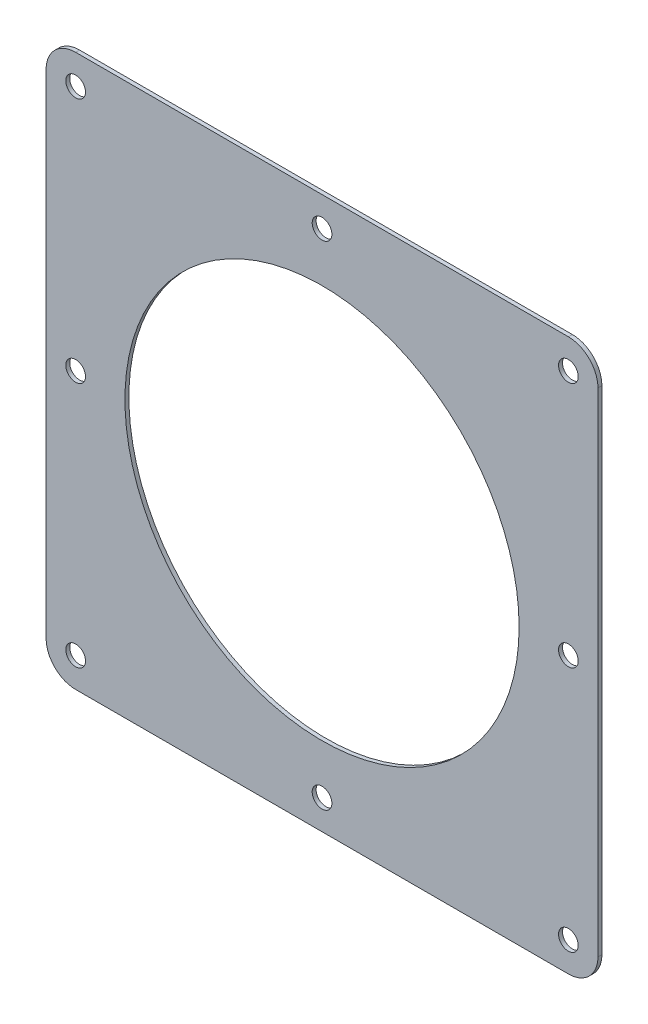
ISO-10303-21;
HEADER;
FILE_DESCRIPTION(('STEP AP214'),'2;1');
FILE_NAME('part.step','',(''),(''),'','','');
FILE_SCHEMA(('AUTOMOTIVE_DESIGN { 1 0 10303 214 1 1 1 1 }'));
ENDSEC;
DATA;
#1=APPLICATION_CONTEXT('core data for automotive mechanical design processes');
#2=APPLICATION_PROTOCOL_DEFINITION('international standard','automotive_design',2000,#1);
#3=PRODUCT_CONTEXT('',#1,'mechanical');
#4=PRODUCT('Part','Part','',(#3));
#5=PRODUCT_RELATED_PRODUCT_CATEGORY('part','',(#4));
#6=PRODUCT_DEFINITION_FORMATION('','',#4);
#7=PRODUCT_DEFINITION_CONTEXT('part definition',#1,'design');
#8=PRODUCT_DEFINITION('design','',#6,#7);
#9=PRODUCT_DEFINITION_SHAPE('','',#8);
#10=(LENGTH_UNIT() NAMED_UNIT(*) SI_UNIT(.MILLI.,.METRE.));
#11=(NAMED_UNIT(*) PLANE_ANGLE_UNIT() SI_UNIT($,.RADIAN.));
#12=(NAMED_UNIT(*) SI_UNIT($,.STERADIAN.) SOLID_ANGLE_UNIT());
#13=UNCERTAINTY_MEASURE_WITH_UNIT(LENGTH_MEASURE(1.E-05),#10,'distance_accuracy_value','');
#14=(GEOMETRIC_REPRESENTATION_CONTEXT(3) GLOBAL_UNCERTAINTY_ASSIGNED_CONTEXT((#13)) GLOBAL_UNIT_ASSIGNED_CONTEXT((#10,
#11,#12)) REPRESENTATION_CONTEXT('',''));
#15=CARTESIAN_POINT('',(0.,0.,0.));
#16=DIRECTION('',(0.,0.,1.));
#17=DIRECTION('',(1.,0.,0.));
#18=AXIS2_PLACEMENT_3D('',#15,#16,#17);
#19=CARTESIAN_POINT('',(-125.,-125.,2.));
#20=DIRECTION('',(0.,0.,1.));
#21=DIRECTION('',(1.,0.,0.));
#22=AXIS2_PLACEMENT_3D('',#19,#20,#21);
#23=PLANE('',#22);
#24=CARTESIAN_POINT('',(0.,0.,2.));
#25=DIRECTION('',(0.,0.,1.));
#26=DIRECTION('',(1.,0.,0.));
#27=AXIS2_PLACEMENT_3D('',#24,#25,#26);
#28=CIRCLE('',#27,100.);
#29=CARTESIAN_POINT('',(100.,0.,2.));
#30=VERTEX_POINT('',#29);
#31=EDGE_CURVE('E228',#30,#30,#28,.T.);
#32=ORIENTED_EDGE('',*,*,#31,.F.);
#33=EDGE_LOOP('',(#32));
#34=FACE_BOUND('',#33,.T.);
#35=CARTESIAN_POINT('',(0.,-125.,2.));
#36=DIRECTION('',(0.,0.,1.));
#37=DIRECTION('',(1.,0.,0.));
#38=AXIS2_PLACEMENT_3D('',#35,#36,#37);
#39=CIRCLE('',#38,5.);
#40=CARTESIAN_POINT('',(5.,-125.,2.));
#41=VERTEX_POINT('',#40);
#42=EDGE_CURVE('E214',#41,#41,#39,.T.);
#43=ORIENTED_EDGE('',*,*,#42,.F.);
#44=EDGE_LOOP('',(#43));
#45=FACE_BOUND('',#44,.T.);
#46=CARTESIAN_POINT('',(125.,0.,2.));
#47=DIRECTION('',(0.,0.,1.));
#48=DIRECTION('',(1.,0.,0.));
#49=AXIS2_PLACEMENT_3D('',#46,#47,#48);
#50=CIRCLE('',#49,5.00000000000001);
#51=CARTESIAN_POINT('',(130.,0.,2.));
#52=VERTEX_POINT('',#51);
#53=EDGE_CURVE('E196',#52,#52,#50,.T.);
#54=ORIENTED_EDGE('',*,*,#53,.F.);
#55=EDGE_LOOP('',(#54));
#56=FACE_BOUND('',#55,.T.);
#57=CARTESIAN_POINT('',(0.,125.,2.));
#58=DIRECTION('',(0.,0.,1.));
#59=DIRECTION('',(1.,0.,0.));
#60=AXIS2_PLACEMENT_3D('',#57,#58,#59);
#61=CIRCLE('',#60,5.);
#62=CARTESIAN_POINT('',(4.99999999999999,125.,2.));
#63=VERTEX_POINT('',#62);
#64=EDGE_CURVE('E184',#63,#63,#61,.T.);
#65=ORIENTED_EDGE('',*,*,#64,.F.);
#66=EDGE_LOOP('',(#65));
#67=FACE_BOUND('',#66,.T.);
#68=CARTESIAN_POINT('',(-125.,-125.,2.));
#69=DIRECTION('',(0.,0.,1.));
#70=DIRECTION('',(1.,0.,0.));
#71=AXIS2_PLACEMENT_3D('',#68,#69,#70);
#72=CIRCLE('',#71,15.);
#73=CARTESIAN_POINT('',(-140.,-125.,2.));
#74=VERTEX_POINT('',#73);
#75=CARTESIAN_POINT('',(-125.,-140.,2.));
#76=VERTEX_POINT('',#75);
#77=EDGE_CURVE('E146',#74,#76,#72,.T.);
#78=ORIENTED_EDGE('',*,*,#77,.T.);
#79=DIRECTION('',(1.,0.,0.));
#80=VECTOR('',#79,1.);
#81=CARTESIAN_POINT('',(-125.,-140.,2.));
#82=LINE('',#81,#80);
#83=CARTESIAN_POINT('',(125.,-140.,2.));
#84=VERTEX_POINT('',#83);
#85=EDGE_CURVE('E94',#76,#84,#82,.T.);
#86=ORIENTED_EDGE('',*,*,#85,.T.);
#87=CARTESIAN_POINT('',(125.,-125.,2.));
#88=DIRECTION('',(0.,0.,1.));
#89=DIRECTION('',(1.,0.,0.));
#90=AXIS2_PLACEMENT_3D('',#87,#88,#89);
#91=CIRCLE('',#90,15.);
#92=CARTESIAN_POINT('',(140.,-125.,2.));
#93=VERTEX_POINT('',#92);
#94=EDGE_CURVE('E162',#84,#93,#91,.T.);
#95=ORIENTED_EDGE('',*,*,#94,.T.);
#96=DIRECTION('',(0.,1.,0.));
#97=VECTOR('',#96,1.);
#98=CARTESIAN_POINT('',(140.,125.,2.));
#99=LINE('',#98,#97);
#100=CARTESIAN_POINT('',(140.,125.,2.));
#101=VERTEX_POINT('',#100);
#102=EDGE_CURVE('E175',#93,#101,#99,.T.);
#103=ORIENTED_EDGE('',*,*,#102,.T.);
#104=CARTESIAN_POINT('',(125.,125.,2.));
#105=DIRECTION('',(0.,0.,1.));
#106=DIRECTION('',(-1.,0.,0.));
#107=AXIS2_PLACEMENT_3D('',#104,#105,#106);
#108=CIRCLE('',#107,15.);
#109=CARTESIAN_POINT('',(125.,140.,2.));
#110=VERTEX_POINT('',#109);
#111=EDGE_CURVE('E113',#101,#110,#108,.T.);
#112=ORIENTED_EDGE('',*,*,#111,.T.);
#113=DIRECTION('',(-1.,0.,0.));
#114=VECTOR('',#113,1.);
#115=CARTESIAN_POINT('',(-125.,140.,2.));
#116=LINE('',#115,#114);
#117=CARTESIAN_POINT('',(-125.,140.,2.));
#118=VERTEX_POINT('',#117);
#119=EDGE_CURVE('E107',#110,#118,#116,.T.);
#120=ORIENTED_EDGE('',*,*,#119,.T.);
#121=CARTESIAN_POINT('',(-125.,125.,2.));
#122=DIRECTION('',(0.,0.,1.));
#123=DIRECTION('',(1.,0.,0.));
#124=AXIS2_PLACEMENT_3D('',#121,#122,#123);
#125=CIRCLE('',#124,15.);
#126=CARTESIAN_POINT('',(-140.,125.,2.));
#127=VERTEX_POINT('',#126);
#128=EDGE_CURVE('E111',#118,#127,#125,.T.);
#129=ORIENTED_EDGE('',*,*,#128,.T.);
#130=DIRECTION('',(0.,-1.,0.));
#131=VECTOR('',#130,1.);
#132=CARTESIAN_POINT('',(-140.,125.,2.));
#133=LINE('',#132,#131);
#134=EDGE_CURVE('E51',#127,#74,#133,.T.);
#135=ORIENTED_EDGE('',*,*,#134,.T.);
#136=EDGE_LOOP('',(#78,#86,#95,#103,#112,#120,#129,#135));
#137=FACE_BOUND('',#136,.T.);
#138=CARTESIAN_POINT('',(-125.,125.,2.));
#139=DIRECTION('',(0.,0.,1.));
#140=DIRECTION('',(1.,0.,0.));
#141=AXIS2_PLACEMENT_3D('',#138,#139,#140);
#142=CIRCLE('',#141,5.00000000000001);
#143=CARTESIAN_POINT('',(-120.,125.,2.));
#144=VERTEX_POINT('',#143);
#145=EDGE_CURVE('E135',#144,#144,#142,.T.);
#146=ORIENTED_EDGE('',*,*,#145,.F.);
#147=EDGE_LOOP('',(#146));
#148=FACE_BOUND('',#147,.T.);
#149=CARTESIAN_POINT('',(125.,125.,2.));
#150=DIRECTION('',(0.,0.,1.));
#151=DIRECTION('',(1.,0.,0.));
#152=AXIS2_PLACEMENT_3D('',#149,#150,#151);
#153=CIRCLE('',#152,4.99999999999999);
#154=CARTESIAN_POINT('',(130.,125.,2.));
#155=VERTEX_POINT('',#154);
#156=EDGE_CURVE('E190',#155,#155,#153,.T.);
#157=ORIENTED_EDGE('',*,*,#156,.F.);
#158=EDGE_LOOP('',(#157));
#159=FACE_BOUND('',#158,.T.);
#160=CARTESIAN_POINT('',(-125.,0.,2.));
#161=DIRECTION('',(0.,0.,1.));
#162=DIRECTION('',(1.,0.,0.));
#163=AXIS2_PLACEMENT_3D('',#160,#161,#162);
#164=CIRCLE('',#163,5.);
#165=CARTESIAN_POINT('',(-120.,0.,2.));
#166=VERTEX_POINT('',#165);
#167=EDGE_CURVE('E202',#166,#166,#164,.T.);
#168=ORIENTED_EDGE('',*,*,#167,.F.);
#169=EDGE_LOOP('',(#168));
#170=FACE_BOUND('',#169,.T.);
#171=CARTESIAN_POINT('',(-125.,-125.,2.));
#172=DIRECTION('',(0.,0.,1.));
#173=DIRECTION('',(1.,0.,0.));
#174=AXIS2_PLACEMENT_3D('',#171,#172,#173);
#175=CIRCLE('',#174,5.00000000000001);
#176=CARTESIAN_POINT('',(-120.,-125.,2.));
#177=VERTEX_POINT('',#176);
#178=EDGE_CURVE('E208',#177,#177,#175,.T.);
#179=ORIENTED_EDGE('',*,*,#178,.F.);
#180=EDGE_LOOP('',(#179));
#181=FACE_BOUND('',#180,.T.);
#182=CARTESIAN_POINT('',(125.,-125.,2.));
#183=DIRECTION('',(0.,0.,1.));
#184=DIRECTION('',(1.,0.,0.));
#185=AXIS2_PLACEMENT_3D('',#182,#183,#184);
#186=CIRCLE('',#185,5.00000000000002);
#187=CARTESIAN_POINT('',(130.,-125.,2.));
#188=VERTEX_POINT('',#187);
#189=EDGE_CURVE('E220',#188,#188,#186,.T.);
#190=ORIENTED_EDGE('',*,*,#189,.F.);
#191=EDGE_LOOP('',(#190));
#192=FACE_BOUND('',#191,.T.);
#193=ADVANCED_FACE('F33',(#34,#45,#56,#67,#137,#148,#159,#170,#181,#192),#23,.T.);
#194=CARTESIAN_POINT('',(-125.,-125.,0.));
#195=DIRECTION('',(0.,0.,1.));
#196=DIRECTION('',(1.,0.,0.));
#197=AXIS2_PLACEMENT_3D('',#194,#195,#196);
#198=PLANE('',#197);
#199=CARTESIAN_POINT('',(0.,0.,0.));
#200=DIRECTION('',(0.,0.,1.));
#201=DIRECTION('',(1.,0.,0.));
#202=AXIS2_PLACEMENT_3D('',#199,#200,#201);
#203=CIRCLE('',#202,100.);
#204=CARTESIAN_POINT('',(100.,0.,0.));
#205=VERTEX_POINT('',#204);
#206=EDGE_CURVE('E37',#205,#205,#203,.T.);
#207=ORIENTED_EDGE('',*,*,#206,.T.);
#208=EDGE_LOOP('',(#207));
#209=FACE_BOUND('',#208,.T.);
#210=CARTESIAN_POINT('',(-125.,-125.,0.));
#211=DIRECTION('',(0.,0.,1.));
#212=DIRECTION('',(1.,0.,0.));
#213=AXIS2_PLACEMENT_3D('',#210,#211,#212);
#214=CIRCLE('',#213,15.);
#215=CARTESIAN_POINT('',(-140.,-125.,0.));
#216=VERTEX_POINT('',#215);
#217=CARTESIAN_POINT('',(-125.,-140.,0.));
#218=VERTEX_POINT('',#217);
#219=EDGE_CURVE('E131',#216,#218,#214,.T.);
#220=ORIENTED_EDGE('',*,*,#219,.F.);
#221=DIRECTION('',(0.,-1.,0.));
#222=VECTOR('',#221,1.);
#223=CARTESIAN_POINT('',(-140.,125.,0.));
#224=LINE('',#223,#222);
#225=CARTESIAN_POINT('',(-140.,125.,0.));
#226=VERTEX_POINT('',#225);
#227=EDGE_CURVE('E86',#226,#216,#224,.T.);
#228=ORIENTED_EDGE('',*,*,#227,.F.);
#229=CARTESIAN_POINT('',(-125.,125.,0.));
#230=DIRECTION('',(0.,0.,1.));
#231=DIRECTION('',(1.,0.,0.));
#232=AXIS2_PLACEMENT_3D('',#229,#230,#231);
#233=CIRCLE('',#232,15.);
#234=CARTESIAN_POINT('',(-125.,140.,0.));
#235=VERTEX_POINT('',#234);
#236=EDGE_CURVE('E80',#235,#226,#233,.T.);
#237=ORIENTED_EDGE('',*,*,#236,.F.);
#238=DIRECTION('',(-1.,0.,0.));
#239=VECTOR('',#238,1.);
#240=CARTESIAN_POINT('',(-125.,140.,0.));
#241=LINE('',#240,#239);
#242=CARTESIAN_POINT('',(125.,140.,0.));
#243=VERTEX_POINT('',#242);
#244=EDGE_CURVE('E121',#243,#235,#241,.T.);
#245=ORIENTED_EDGE('',*,*,#244,.F.);
#246=CARTESIAN_POINT('',(125.,125.,0.));
#247=DIRECTION('',(0.,0.,1.));
#248=DIRECTION('',(-1.,0.,0.));
#249=AXIS2_PLACEMENT_3D('',#246,#247,#248);
#250=CIRCLE('',#249,15.);
#251=CARTESIAN_POINT('',(140.,125.,0.));
#252=VERTEX_POINT('',#251);
#253=EDGE_CURVE('E141',#252,#243,#250,.T.);
#254=ORIENTED_EDGE('',*,*,#253,.F.);
#255=DIRECTION('',(0.,1.,0.));
#256=VECTOR('',#255,1.);
#257=CARTESIAN_POINT('',(140.,125.,0.));
#258=LINE('',#257,#256);
#259=CARTESIAN_POINT('',(140.,-125.,0.));
#260=VERTEX_POINT('',#259);
#261=EDGE_CURVE('E139',#260,#252,#258,.T.);
#262=ORIENTED_EDGE('',*,*,#261,.F.);
#263=CARTESIAN_POINT('',(125.,-125.,0.));
#264=DIRECTION('',(0.,0.,1.));
#265=DIRECTION('',(1.,0.,0.));
#266=AXIS2_PLACEMENT_3D('',#263,#264,#265);
#267=CIRCLE('',#266,15.);
#268=CARTESIAN_POINT('',(125.,-140.,0.));
#269=VERTEX_POINT('',#268);
#270=EDGE_CURVE('E137',#269,#260,#267,.T.);
#271=ORIENTED_EDGE('',*,*,#270,.F.);
#272=DIRECTION('',(1.,0.,0.));
#273=VECTOR('',#272,1.);
#274=CARTESIAN_POINT('',(-125.,-140.,0.));
#275=LINE('',#274,#273);
#276=EDGE_CURVE('E134',#218,#269,#275,.T.);
#277=ORIENTED_EDGE('',*,*,#276,.F.);
#278=EDGE_LOOP('',(#220,#228,#237,#245,#254,#262,#271,#277));
#279=FACE_BOUND('',#278,.T.);
#280=CARTESIAN_POINT('',(-125.,125.,0.));
#281=DIRECTION('',(0.,0.,1.));
#282=DIRECTION('',(1.,0.,0.));
#283=AXIS2_PLACEMENT_3D('',#280,#281,#282);
#284=CIRCLE('',#283,5.00000000000001);
#285=CARTESIAN_POINT('',(-120.,125.,0.));
#286=VERTEX_POINT('',#285);
#287=EDGE_CURVE('E181',#286,#286,#284,.T.);
#288=ORIENTED_EDGE('',*,*,#287,.T.);
#289=EDGE_LOOP('',(#288));
#290=FACE_BOUND('',#289,.T.);
#291=CARTESIAN_POINT('',(0.,125.,0.));
#292=DIRECTION('',(0.,0.,1.));
#293=DIRECTION('',(1.,0.,0.));
#294=AXIS2_PLACEMENT_3D('',#291,#292,#293);
#295=CIRCLE('',#294,5.);
#296=CARTESIAN_POINT('',(4.99999999999999,125.,0.));
#297=VERTEX_POINT('',#296);
#298=EDGE_CURVE('E187',#297,#297,#295,.T.);
#299=ORIENTED_EDGE('',*,*,#298,.T.);
#300=EDGE_LOOP('',(#299));
#301=FACE_BOUND('',#300,.T.);
#302=CARTESIAN_POINT('',(125.,125.,0.));
#303=DIRECTION('',(0.,0.,1.));
#304=DIRECTION('',(1.,0.,0.));
#305=AXIS2_PLACEMENT_3D('',#302,#303,#304);
#306=CIRCLE('',#305,4.99999999999999);
#307=CARTESIAN_POINT('',(130.,125.,0.));
#308=VERTEX_POINT('',#307);
#309=EDGE_CURVE('E193',#308,#308,#306,.T.);
#310=ORIENTED_EDGE('',*,*,#309,.T.);
#311=EDGE_LOOP('',(#310));
#312=FACE_BOUND('',#311,.T.);
#313=CARTESIAN_POINT('',(125.,0.,0.));
#314=DIRECTION('',(0.,0.,1.));
#315=DIRECTION('',(1.,0.,0.));
#316=AXIS2_PLACEMENT_3D('',#313,#314,#315);
#317=CIRCLE('',#316,5.00000000000001);
#318=CARTESIAN_POINT('',(130.,0.,0.));
#319=VERTEX_POINT('',#318);
#320=EDGE_CURVE('E199',#319,#319,#317,.T.);
#321=ORIENTED_EDGE('',*,*,#320,.T.);
#322=EDGE_LOOP('',(#321));
#323=FACE_BOUND('',#322,.T.);
#324=CARTESIAN_POINT('',(-125.,0.,0.));
#325=DIRECTION('',(0.,0.,1.));
#326=DIRECTION('',(1.,0.,0.));
#327=AXIS2_PLACEMENT_3D('',#324,#325,#326);
#328=CIRCLE('',#327,5.);
#329=CARTESIAN_POINT('',(-120.,0.,0.));
#330=VERTEX_POINT('',#329);
#331=EDGE_CURVE('E205',#330,#330,#328,.T.);
#332=ORIENTED_EDGE('',*,*,#331,.T.);
#333=EDGE_LOOP('',(#332));
#334=FACE_BOUND('',#333,.T.);
#335=CARTESIAN_POINT('',(-125.,-125.,0.));
#336=DIRECTION('',(0.,0.,1.));
#337=DIRECTION('',(1.,0.,0.));
#338=AXIS2_PLACEMENT_3D('',#335,#336,#337);
#339=CIRCLE('',#338,5.00000000000001);
#340=CARTESIAN_POINT('',(-120.,-125.,0.));
#341=VERTEX_POINT('',#340);
#342=EDGE_CURVE('E211',#341,#341,#339,.T.);
#343=ORIENTED_EDGE('',*,*,#342,.T.);
#344=EDGE_LOOP('',(#343));
#345=FACE_BOUND('',#344,.T.);
#346=CARTESIAN_POINT('',(0.,-125.,0.));
#347=DIRECTION('',(0.,0.,1.));
#348=DIRECTION('',(1.,0.,0.));
#349=AXIS2_PLACEMENT_3D('',#346,#347,#348);
#350=CIRCLE('',#349,5.);
#351=CARTESIAN_POINT('',(5.,-125.,0.));
#352=VERTEX_POINT('',#351);
#353=EDGE_CURVE('E217',#352,#352,#350,.T.);
#354=ORIENTED_EDGE('',*,*,#353,.T.);
#355=EDGE_LOOP('',(#354));
#356=FACE_BOUND('',#355,.T.);
#357=CARTESIAN_POINT('',(125.,-125.,0.));
#358=DIRECTION('',(0.,0.,1.));
#359=DIRECTION('',(1.,0.,0.));
#360=AXIS2_PLACEMENT_3D('',#357,#358,#359);
#361=CIRCLE('',#360,5.00000000000002);
#362=CARTESIAN_POINT('',(130.,-125.,0.));
#363=VERTEX_POINT('',#362);
#364=EDGE_CURVE('E223',#363,#363,#361,.T.);
#365=ORIENTED_EDGE('',*,*,#364,.T.);
#366=EDGE_LOOP('',(#365));
#367=FACE_BOUND('',#366,.T.);
#368=ADVANCED_FACE('F166',(#209,#279,#290,#301,#312,#323,#334,#345,#356,#367),#198,.F.);
#369=CARTESIAN_POINT('',(-125.,-125.,2.));
#370=DIRECTION('',(0.,0.,-1.));
#371=DIRECTION('',(-1.,0.,0.));
#372=AXIS2_PLACEMENT_3D('',#369,#370,#371);
#373=CYLINDRICAL_SURFACE('',#372,15.);
#374=ORIENTED_EDGE('',*,*,#219,.T.);
#375=DIRECTION('',(0.,0.,-1.));
#376=VECTOR('',#375,1.);
#377=CARTESIAN_POINT('',(-125.,-140.,2.));
#378=LINE('',#377,#376);
#379=EDGE_CURVE('E11',#76,#218,#378,.T.);
#380=ORIENTED_EDGE('',*,*,#379,.F.);
#381=ORIENTED_EDGE('',*,*,#77,.F.);
#382=DIRECTION('',(0.,0.,-1.));
#383=VECTOR('',#382,1.);
#384=CARTESIAN_POINT('',(-140.,-125.,2.));
#385=LINE('',#384,#383);
#386=EDGE_CURVE('E127',#74,#216,#385,.T.);
#387=ORIENTED_EDGE('',*,*,#386,.T.);
#388=EDGE_LOOP('',(#374,#380,#381,#387));
#389=FACE_BOUND('',#388,.T.);
#390=ADVANCED_FACE('F35',(#389),#373,.T.);
#391=CARTESIAN_POINT('',(-125.,-140.,2.));
#392=DIRECTION('',(0.,1.,0.));
#393=DIRECTION('',(0.,0.,1.));
#394=AXIS2_PLACEMENT_3D('',#391,#392,#393);
#395=PLANE('',#394);
#396=ORIENTED_EDGE('',*,*,#276,.T.);
#397=DIRECTION('',(0.,0.,-1.));
#398=VECTOR('',#397,1.);
#399=CARTESIAN_POINT('',(125.,-140.,2.));
#400=LINE('',#399,#398);
#401=EDGE_CURVE('E43',#84,#269,#400,.T.);
#402=ORIENTED_EDGE('',*,*,#401,.F.);
#403=ORIENTED_EDGE('',*,*,#85,.F.);
#404=ORIENTED_EDGE('',*,*,#379,.T.);
#405=EDGE_LOOP('',(#396,#402,#403,#404));
#406=FACE_BOUND('',#405,.T.);
#407=ADVANCED_FACE('F270',(#406),#395,.F.);
#408=CARTESIAN_POINT('',(125.,-125.,2.));
#409=DIRECTION('',(0.,0.,-1.));
#410=DIRECTION('',(-1.,0.,0.));
#411=AXIS2_PLACEMENT_3D('',#408,#409,#410);
#412=CYLINDRICAL_SURFACE('',#411,15.);
#413=ORIENTED_EDGE('',*,*,#270,.T.);
#414=DIRECTION('',(0.,0.,-1.));
#415=VECTOR('',#414,1.);
#416=CARTESIAN_POINT('',(140.,-125.,2.));
#417=LINE('',#416,#415);
#418=EDGE_CURVE('E153',#93,#260,#417,.T.);
#419=ORIENTED_EDGE('',*,*,#418,.F.);
#420=ORIENTED_EDGE('',*,*,#94,.F.);
#421=ORIENTED_EDGE('',*,*,#401,.T.);
#422=EDGE_LOOP('',(#413,#419,#420,#421));
#423=FACE_BOUND('',#422,.T.);
#424=ADVANCED_FACE('F160',(#423),#412,.T.);
#425=CARTESIAN_POINT('',(140.,125.,2.));
#426=DIRECTION('',(-1.,0.,0.));
#427=DIRECTION('',(0.,0.,1.));
#428=AXIS2_PLACEMENT_3D('',#425,#426,#427);
#429=PLANE('',#428);
#430=ORIENTED_EDGE('',*,*,#261,.T.);
#431=DIRECTION('',(0.,0.,-1.));
#432=VECTOR('',#431,1.);
#433=CARTESIAN_POINT('',(140.,125.,2.));
#434=LINE('',#433,#432);
#435=EDGE_CURVE('E150',#101,#252,#434,.T.);
#436=ORIENTED_EDGE('',*,*,#435,.F.);
#437=ORIENTED_EDGE('',*,*,#102,.F.);
#438=ORIENTED_EDGE('',*,*,#418,.T.);
#439=EDGE_LOOP('',(#430,#436,#437,#438));
#440=FACE_BOUND('',#439,.T.);
#441=ADVANCED_FACE('F171',(#440),#429,.F.);
#442=CARTESIAN_POINT('',(125.,125.,2.));
#443=DIRECTION('',(0.,0.,-1.));
#444=DIRECTION('',(-1.,0.,0.));
#445=AXIS2_PLACEMENT_3D('',#442,#443,#444);
#446=CYLINDRICAL_SURFACE('',#445,15.);
#447=ORIENTED_EDGE('',*,*,#253,.T.);
#448=DIRECTION('',(0.,0.,-1.));
#449=VECTOR('',#448,1.);
#450=CARTESIAN_POINT('',(125.,140.,2.));
#451=LINE('',#450,#449);
#452=EDGE_CURVE('E122',#110,#243,#451,.T.);
#453=ORIENTED_EDGE('',*,*,#452,.F.);
#454=ORIENTED_EDGE('',*,*,#111,.F.);
#455=ORIENTED_EDGE('',*,*,#435,.T.);
#456=EDGE_LOOP('',(#447,#453,#454,#455));
#457=FACE_BOUND('',#456,.T.);
#458=ADVANCED_FACE('F174',(#457),#446,.T.);
#459=CARTESIAN_POINT('',(-125.,140.,2.));
#460=DIRECTION('',(0.,-1.,0.));
#461=DIRECTION('',(0.,0.,-1.));
#462=AXIS2_PLACEMENT_3D('',#459,#460,#461);
#463=PLANE('',#462);
#464=ORIENTED_EDGE('',*,*,#244,.T.);
#465=DIRECTION('',(0.,0.,-1.));
#466=VECTOR('',#465,1.);
#467=CARTESIAN_POINT('',(-125.,140.,2.));
#468=LINE('',#467,#466);
#469=EDGE_CURVE('E118',#118,#235,#468,.T.);
#470=ORIENTED_EDGE('',*,*,#469,.F.);
#471=ORIENTED_EDGE('',*,*,#119,.F.);
#472=ORIENTED_EDGE('',*,*,#452,.T.);
#473=EDGE_LOOP('',(#464,#470,#471,#472));
#474=FACE_BOUND('',#473,.T.);
#475=ADVANCED_FACE('F119',(#474),#463,.F.);
#476=CARTESIAN_POINT('',(-125.,125.,2.));
#477=DIRECTION('',(0.,0.,-1.));
#478=DIRECTION('',(-1.,0.,0.));
#479=AXIS2_PLACEMENT_3D('',#476,#477,#478);
#480=CYLINDRICAL_SURFACE('',#479,15.);
#481=ORIENTED_EDGE('',*,*,#236,.T.);
#482=DIRECTION('',(0.,0.,-1.));
#483=VECTOR('',#482,1.);
#484=CARTESIAN_POINT('',(-140.,125.,2.));
#485=LINE('',#484,#483);
#486=EDGE_CURVE('E123',#127,#226,#485,.T.);
#487=ORIENTED_EDGE('',*,*,#486,.F.);
#488=ORIENTED_EDGE('',*,*,#128,.F.);
#489=ORIENTED_EDGE('',*,*,#469,.T.);
#490=EDGE_LOOP('',(#481,#487,#488,#489));
#491=FACE_BOUND('',#490,.T.);
#492=ADVANCED_FACE('F125',(#491),#480,.T.);
#493=CARTESIAN_POINT('',(-140.,125.,2.));
#494=DIRECTION('',(1.,0.,0.));
#495=DIRECTION('',(0.,0.,-1.));
#496=AXIS2_PLACEMENT_3D('',#493,#494,#495);
#497=PLANE('',#496);
#498=ORIENTED_EDGE('',*,*,#227,.T.);
#499=ORIENTED_EDGE('',*,*,#386,.F.);
#500=ORIENTED_EDGE('',*,*,#134,.F.);
#501=ORIENTED_EDGE('',*,*,#486,.T.);
#502=EDGE_LOOP('',(#498,#499,#500,#501));
#503=FACE_BOUND('',#502,.T.);
#504=ADVANCED_FACE('F258',(#503),#497,.F.);
#505=CARTESIAN_POINT('',(-125.,125.,2.));
#506=DIRECTION('',(0.,0.,-1.));
#507=DIRECTION('',(-1.,0.,0.));
#508=AXIS2_PLACEMENT_3D('',#505,#506,#507);
#509=CYLINDRICAL_SURFACE('',#508,5.00000000000001);
#510=ORIENTED_EDGE('',*,*,#145,.T.);
#511=EDGE_LOOP('',(#510));
#512=FACE_BOUND('',#511,.T.);
#513=ORIENTED_EDGE('',*,*,#287,.F.);
#514=EDGE_LOOP('',(#513));
#515=FACE_BOUND('',#514,.T.);
#516=ADVANCED_FACE('F255',(#512,#515),#509,.F.);
#517=CARTESIAN_POINT('',(0.,125.,2.));
#518=DIRECTION('',(0.,0.,-1.));
#519=DIRECTION('',(-1.,0.,0.));
#520=AXIS2_PLACEMENT_3D('',#517,#518,#519);
#521=CYLINDRICAL_SURFACE('',#520,5.);
#522=ORIENTED_EDGE('',*,*,#64,.T.);
#523=EDGE_LOOP('',(#522));
#524=FACE_BOUND('',#523,.T.);
#525=ORIENTED_EDGE('',*,*,#298,.F.);
#526=EDGE_LOOP('',(#525));
#527=FACE_BOUND('',#526,.T.);
#528=ADVANCED_FACE('F341',(#524,#527),#521,.F.);
#529=CARTESIAN_POINT('',(125.,125.,2.));
#530=DIRECTION('',(0.,0.,-1.));
#531=DIRECTION('',(-1.,0.,0.));
#532=AXIS2_PLACEMENT_3D('',#529,#530,#531);
#533=CYLINDRICAL_SURFACE('',#532,4.99999999999999);
#534=ORIENTED_EDGE('',*,*,#156,.T.);
#535=EDGE_LOOP('',(#534));
#536=FACE_BOUND('',#535,.T.);
#537=ORIENTED_EDGE('',*,*,#309,.F.);
#538=EDGE_LOOP('',(#537));
#539=FACE_BOUND('',#538,.T.);
#540=ADVANCED_FACE('F332',(#536,#539),#533,.F.);
#541=CARTESIAN_POINT('',(125.,0.,2.));
#542=DIRECTION('',(0.,0.,-1.));
#543=DIRECTION('',(-1.,0.,0.));
#544=AXIS2_PLACEMENT_3D('',#541,#542,#543);
#545=CYLINDRICAL_SURFACE('',#544,5.00000000000001);
#546=ORIENTED_EDGE('',*,*,#53,.T.);
#547=EDGE_LOOP('',(#546));
#548=FACE_BOUND('',#547,.T.);
#549=ORIENTED_EDGE('',*,*,#320,.F.);
#550=EDGE_LOOP('',(#549));
#551=FACE_BOUND('',#550,.T.);
#552=ADVANCED_FACE('F323',(#548,#551),#545,.F.);
#553=CARTESIAN_POINT('',(-125.,0.,2.));
#554=DIRECTION('',(0.,0.,-1.));
#555=DIRECTION('',(-1.,0.,0.));
#556=AXIS2_PLACEMENT_3D('',#553,#554,#555);
#557=CYLINDRICAL_SURFACE('',#556,5.);
#558=ORIENTED_EDGE('',*,*,#167,.T.);
#559=EDGE_LOOP('',(#558));
#560=FACE_BOUND('',#559,.T.);
#561=ORIENTED_EDGE('',*,*,#331,.F.);
#562=EDGE_LOOP('',(#561));
#563=FACE_BOUND('',#562,.T.);
#564=ADVANCED_FACE('F314',(#560,#563),#557,.F.);
#565=CARTESIAN_POINT('',(-125.,-125.,2.));
#566=DIRECTION('',(0.,0.,-1.));
#567=DIRECTION('',(-1.,0.,0.));
#568=AXIS2_PLACEMENT_3D('',#565,#566,#567);
#569=CYLINDRICAL_SURFACE('',#568,5.00000000000001);
#570=ORIENTED_EDGE('',*,*,#178,.T.);
#571=EDGE_LOOP('',(#570));
#572=FACE_BOUND('',#571,.T.);
#573=ORIENTED_EDGE('',*,*,#342,.F.);
#574=EDGE_LOOP('',(#573));
#575=FACE_BOUND('',#574,.T.);
#576=ADVANCED_FACE('F305',(#572,#575),#569,.F.);
#577=CARTESIAN_POINT('',(0.,-125.,2.));
#578=DIRECTION('',(0.,0.,-1.));
#579=DIRECTION('',(-1.,0.,0.));
#580=AXIS2_PLACEMENT_3D('',#577,#578,#579);
#581=CYLINDRICAL_SURFACE('',#580,5.);
#582=ORIENTED_EDGE('',*,*,#42,.T.);
#583=EDGE_LOOP('',(#582));
#584=FACE_BOUND('',#583,.T.);
#585=ORIENTED_EDGE('',*,*,#353,.F.);
#586=EDGE_LOOP('',(#585));
#587=FACE_BOUND('',#586,.T.);
#588=ADVANCED_FACE('F243',(#584,#587),#581,.F.);
#589=CARTESIAN_POINT('',(125.,-125.,2.));
#590=DIRECTION('',(0.,0.,-1.));
#591=DIRECTION('',(-1.,0.,0.));
#592=AXIS2_PLACEMENT_3D('',#589,#590,#591);
#593=CYLINDRICAL_SURFACE('',#592,5.00000000000002);
#594=ORIENTED_EDGE('',*,*,#189,.T.);
#595=EDGE_LOOP('',(#594));
#596=FACE_BOUND('',#595,.T.);
#597=ORIENTED_EDGE('',*,*,#364,.F.);
#598=EDGE_LOOP('',(#597));
#599=FACE_BOUND('',#598,.T.);
#600=ADVANCED_FACE('F238',(#596,#599),#593,.F.);
#601=CARTESIAN_POINT('',(0.,0.,-8.));
#602=DIRECTION('',(0.,0.,1.));
#603=DIRECTION('',(1.,0.,0.));
#604=AXIS2_PLACEMENT_3D('',#601,#602,#603);
#605=CYLINDRICAL_SURFACE('',#604,100.);
#606=ORIENTED_EDGE('',*,*,#31,.T.);
#607=EDGE_LOOP('',(#606));
#608=FACE_BOUND('',#607,.T.);
#609=ORIENTED_EDGE('',*,*,#206,.F.);
#610=EDGE_LOOP('',(#609));
#611=FACE_BOUND('',#610,.T.);
#612=ADVANCED_FACE('F236',(#608,#611),#605,.F.);
#613=CLOSED_SHELL('',(#193,#368,#390,#407,#424,#441,#458,#475,#492,#504,#516,#528,#540,#552,
#564,#576,#588,#600,#612));
#614=MANIFOLD_SOLID_BREP('B2',#613);
#615=ADVANCED_BREP_SHAPE_REPRESENTATION('',(#18,#614),#14);
#616=SHAPE_DEFINITION_REPRESENTATION(#9,#615);
ENDSEC;
END-ISO-10303-21;
